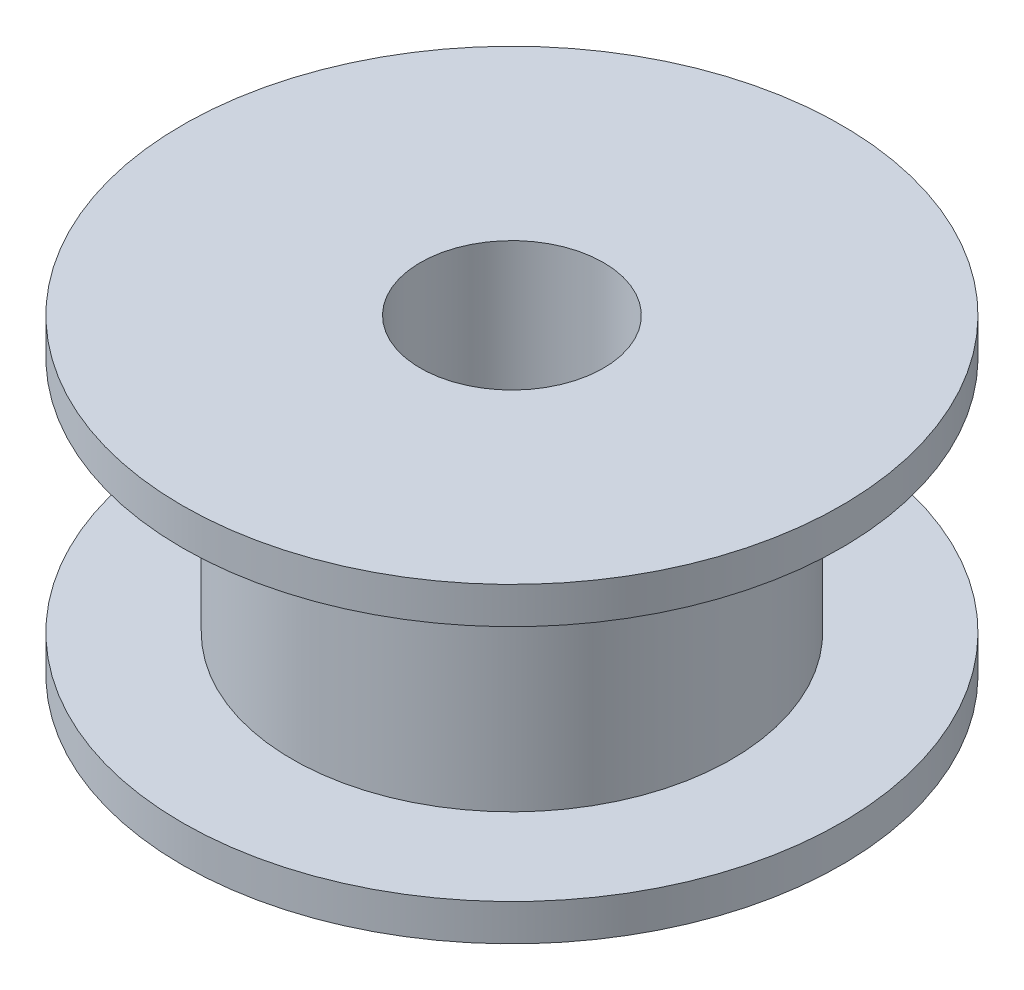
ISO-10303-21;
HEADER;
FILE_DESCRIPTION(('STEP AP214'),'2;1');
FILE_NAME('part.step','',(''),(''),'','','');
FILE_SCHEMA(('AUTOMOTIVE_DESIGN { 1 0 10303 214 1 1 1 1 }'));
ENDSEC;
DATA;
#1=APPLICATION_CONTEXT('core data for automotive mechanical design processes');
#2=APPLICATION_PROTOCOL_DEFINITION('international standard','automotive_design',2000,#1);
#3=PRODUCT_CONTEXT('',#1,'mechanical');
#4=PRODUCT('Part','Part','',(#3));
#5=PRODUCT_RELATED_PRODUCT_CATEGORY('part','',(#4));
#6=PRODUCT_DEFINITION_FORMATION('','',#4);
#7=PRODUCT_DEFINITION_CONTEXT('part definition',#1,'design');
#8=PRODUCT_DEFINITION('design','',#6,#7);
#9=PRODUCT_DEFINITION_SHAPE('','',#8);
#10=(LENGTH_UNIT() NAMED_UNIT(*) SI_UNIT(.MILLI.,.METRE.));
#11=(NAMED_UNIT(*) PLANE_ANGLE_UNIT() SI_UNIT($,.RADIAN.));
#12=(NAMED_UNIT(*) SI_UNIT($,.STERADIAN.) SOLID_ANGLE_UNIT());
#13=UNCERTAINTY_MEASURE_WITH_UNIT(LENGTH_MEASURE(1.E-05),#10,'distance_accuracy_value','');
#14=(GEOMETRIC_REPRESENTATION_CONTEXT(3) GLOBAL_UNCERTAINTY_ASSIGNED_CONTEXT((#13)) GLOBAL_UNIT_ASSIGNED_CONTEXT((#10,
#11,#12)) REPRESENTATION_CONTEXT('',''));
#15=CARTESIAN_POINT('',(0.,0.,0.));
#16=DIRECTION('',(0.,0.,1.));
#17=DIRECTION('',(1.,0.,0.));
#18=AXIS2_PLACEMENT_3D('',#15,#16,#17);
#19=CARTESIAN_POINT('',(0.,1.,0.));
#20=DIRECTION('',(0.,-1.,0.));
#21=DIRECTION('',(0.,0.,-1.));
#22=AXIS2_PLACEMENT_3D('',#19,#20,#21);
#23=CYLINDRICAL_SURFACE('',#22,9.);
#24=CARTESIAN_POINT('',(0.,1.,0.));
#25=DIRECTION('',(0.,1.,0.));
#26=DIRECTION('',(0.,0.,1.));
#27=AXIS2_PLACEMENT_3D('',#24,#25,#26);
#28=CIRCLE('',#27,9.);
#29=CARTESIAN_POINT('',(0.,1.,9.));
#30=VERTEX_POINT('',#29);
#31=EDGE_CURVE('E40',#30,#30,#28,.T.);
#32=ORIENTED_EDGE('',*,*,#31,.F.);
#33=EDGE_LOOP('',(#32));
#34=FACE_BOUND('',#33,.T.);
#35=CARTESIAN_POINT('',(0.,0.,0.));
#36=DIRECTION('',(0.,1.,0.));
#37=DIRECTION('',(0.,0.,1.));
#38=AXIS2_PLACEMENT_3D('',#35,#36,#37);
#39=CIRCLE('',#38,9.);
#40=CARTESIAN_POINT('',(0.,0.,9.));
#41=VERTEX_POINT('',#40);
#42=EDGE_CURVE('E36',#41,#41,#39,.T.);
#43=ORIENTED_EDGE('',*,*,#42,.T.);
#44=EDGE_LOOP('',(#43));
#45=FACE_BOUND('',#44,.T.);
#46=ADVANCED_FACE('F33',(#34,#45),#23,.T.);
#47=CARTESIAN_POINT('',(0.,1.,0.));
#48=DIRECTION('',(0.,1.,0.));
#49=DIRECTION('',(0.,0.,1.));
#50=AXIS2_PLACEMENT_3D('',#47,#48,#49);
#51=PLANE('',#50);
#52=CARTESIAN_POINT('',(0.,1.,0.));
#53=DIRECTION('',(0.,1.,0.));
#54=DIRECTION('',(0.,0.,1.));
#55=AXIS2_PLACEMENT_3D('',#52,#53,#54);
#56=CIRCLE('',#55,6.);
#57=CARTESIAN_POINT('',(0.,1.,-6.));
#58=VERTEX_POINT('',#57);
#59=EDGE_CURVE('E10',#58,#58,#56,.T.);
#60=ORIENTED_EDGE('',*,*,#59,.F.);
#61=EDGE_LOOP('',(#60));
#62=FACE_BOUND('',#61,.T.);
#63=ORIENTED_EDGE('',*,*,#31,.T.);
#64=EDGE_LOOP('',(#63));
#65=FACE_BOUND('',#64,.T.);
#66=ADVANCED_FACE('F76',(#62,#65),#51,.T.);
#67=CARTESIAN_POINT('',(0.,0.,0.));
#68=DIRECTION('',(0.,1.,0.));
#69=DIRECTION('',(0.,0.,1.));
#70=AXIS2_PLACEMENT_3D('',#67,#68,#69);
#71=PLANE('',#70);
#72=CARTESIAN_POINT('',(0.,0.,0.));
#73=DIRECTION('',(0.,-1.,0.));
#74=DIRECTION('',(0.,0.,-1.));
#75=AXIS2_PLACEMENT_3D('',#72,#73,#74);
#76=CIRCLE('',#75,2.5);
#77=CARTESIAN_POINT('',(0.,0.,-2.5));
#78=VERTEX_POINT('',#77);
#79=EDGE_CURVE('E56',#78,#78,#76,.T.);
#80=ORIENTED_EDGE('',*,*,#79,.F.);
#81=EDGE_LOOP('',(#80));
#82=FACE_BOUND('',#81,.T.);
#83=ORIENTED_EDGE('',*,*,#42,.F.);
#84=EDGE_LOOP('',(#83));
#85=FACE_BOUND('',#84,.T.);
#86=ADVANCED_FACE('F72',(#82,#85),#71,.F.);
#87=CARTESIAN_POINT('',(0.,7.5,0.));
#88=DIRECTION('',(0.,-1.,0.));
#89=DIRECTION('',(0.,0.,-1.));
#90=AXIS2_PLACEMENT_3D('',#87,#88,#89);
#91=CYLINDRICAL_SURFACE('',#90,6.);
#92=CARTESIAN_POINT('',(0.,7.5,0.));
#93=DIRECTION('',(0.,1.,0.));
#94=DIRECTION('',(0.,0.,1.));
#95=AXIS2_PLACEMENT_3D('',#92,#93,#94);
#96=CIRCLE('',#95,6.);
#97=CARTESIAN_POINT('',(0.,7.5,-6.));
#98=VERTEX_POINT('',#97);
#99=EDGE_CURVE('E46',#98,#98,#96,.T.);
#100=CARTESIAN_POINT('',(0.,7.5,-6.));
#101=CARTESIAN_POINT('',(0.,7.43229166666667,-6.));
#102=CARTESIAN_POINT('',(0.,7.36458333333333,-6.));
#103=CARTESIAN_POINT('',(0.,7.22916666666667,-6.));
#104=CARTESIAN_POINT('',(0.,7.16145833333333,-6.));
#105=CARTESIAN_POINT('',(0.,7.02604166666667,-6.));
#106=CARTESIAN_POINT('',(0.,6.95833333333333,-6.));
#107=CARTESIAN_POINT('',(0.,6.82291666666667,-6.));
#108=CARTESIAN_POINT('',(0.,6.75520833333333,-6.));
#109=CARTESIAN_POINT('',(0.,6.61979166666667,-6.));
#110=CARTESIAN_POINT('',(0.,6.55208333333333,-6.));
#111=CARTESIAN_POINT('',(0.,6.41666666666667,-6.));
#112=CARTESIAN_POINT('',(0.,6.34895833333333,-6.));
#113=CARTESIAN_POINT('',(0.,6.21354166666667,-6.));
#114=CARTESIAN_POINT('',(0.,6.14583333333333,-6.));
#115=CARTESIAN_POINT('',(0.,6.01041666666667,-6.));
#116=CARTESIAN_POINT('',(0.,5.94270833333333,-6.));
#117=CARTESIAN_POINT('',(0.,5.80729166666667,-6.));
#118=CARTESIAN_POINT('',(0.,5.73958333333333,-6.));
#119=CARTESIAN_POINT('',(0.,5.60416666666667,-6.));
#120=CARTESIAN_POINT('',(0.,5.53645833333333,-6.));
#121=CARTESIAN_POINT('',(0.,5.40104166666667,-6.));
#122=CARTESIAN_POINT('',(0.,5.33333333333333,-6.));
#123=CARTESIAN_POINT('',(0.,5.19791666666667,-6.));
#124=CARTESIAN_POINT('',(0.,5.13020833333333,-6.));
#125=CARTESIAN_POINT('',(0.,4.99479166666667,-6.));
#126=CARTESIAN_POINT('',(0.,4.92708333333333,-6.));
#127=CARTESIAN_POINT('',(0.,4.79166666666667,-6.));
#128=CARTESIAN_POINT('',(0.,4.72395833333333,-6.));
#129=CARTESIAN_POINT('',(0.,4.58854166666667,-6.));
#130=CARTESIAN_POINT('',(0.,4.52083333333333,-6.));
#131=CARTESIAN_POINT('',(0.,4.38541666666667,-6.));
#132=CARTESIAN_POINT('',(0.,4.31770833333333,-6.));
#133=CARTESIAN_POINT('',(0.,4.18229166666667,-6.));
#134=CARTESIAN_POINT('',(0.,4.11458333333333,-6.));
#135=CARTESIAN_POINT('',(0.,3.97916666666667,-6.));
#136=CARTESIAN_POINT('',(0.,3.91145833333333,-6.));
#137=CARTESIAN_POINT('',(0.,3.77604166666667,-6.));
#138=CARTESIAN_POINT('',(0.,3.70833333333333,-6.));
#139=CARTESIAN_POINT('',(0.,3.57291666666667,-6.));
#140=CARTESIAN_POINT('',(0.,3.50520833333333,-6.));
#141=CARTESIAN_POINT('',(0.,3.36979166666667,-6.));
#142=CARTESIAN_POINT('',(0.,3.30208333333333,-6.));
#143=CARTESIAN_POINT('',(0.,3.16666666666667,-6.));
#144=CARTESIAN_POINT('',(0.,3.09895833333333,-6.));
#145=CARTESIAN_POINT('',(0.,2.96354166666667,-6.));
#146=CARTESIAN_POINT('',(0.,2.89583333333333,-6.));
#147=CARTESIAN_POINT('',(0.,2.76041666666667,-6.));
#148=CARTESIAN_POINT('',(0.,2.69270833333333,-6.));
#149=CARTESIAN_POINT('',(0.,2.55729166666667,-6.));
#150=CARTESIAN_POINT('',(0.,2.48958333333333,-6.));
#151=CARTESIAN_POINT('',(0.,2.35416666666667,-6.));
#152=CARTESIAN_POINT('',(0.,2.28645833333333,-6.));
#153=CARTESIAN_POINT('',(0.,2.15104166666667,-6.));
#154=CARTESIAN_POINT('',(0.,2.08333333333333,-6.));
#155=CARTESIAN_POINT('',(0.,1.94791666666667,-6.));
#156=CARTESIAN_POINT('',(0.,1.88020833333333,-6.));
#157=CARTESIAN_POINT('',(0.,1.74479166666667,-6.));
#158=CARTESIAN_POINT('',(0.,1.67708333333333,-6.));
#159=CARTESIAN_POINT('',(0.,1.54166666666667,-6.));
#160=CARTESIAN_POINT('',(0.,1.47395833333333,-6.));
#161=CARTESIAN_POINT('',(0.,1.33854166666667,-6.));
#162=CARTESIAN_POINT('',(0.,1.27083333333333,-6.));
#163=CARTESIAN_POINT('',(0.,1.13541666666667,-6.));
#164=CARTESIAN_POINT('',(0.,1.06770833333333,-6.));
#165=CARTESIAN_POINT('',(0.,1.,-6.));
#166=B_SPLINE_CURVE_WITH_KNOTS('',3,(#100,#101,#102,#103,#104,#105,#106,#107,#108,#109,#110,
#111,#112,#113,#114,#115,#116,#117,#118,#119,#120,#121,#122,#123,#124,#125,#126,#127,#128,#129,
#130,#131,#132,#133,#134,#135,#136,#137,#138,#139,#140,#141,#142,#143,#144,#145,#146,#147,#148,
#149,#150,#151,#152,#153,#154,#155,#156,#157,#158,#159,#160,#161,#162,#163,#164,#165),
.UNSPECIFIED.,.F.,.F.,(4,2,2,2,2,2,2,2,2,2,2,2,2,2,2,2,2,2,2,2,2,2,2,2,2,2,2,2,2,2,2,2,4),(0.,
0.203125,0.40625,0.609375000000001,0.812500000000001,1.015625,1.21875,1.421875,1.625,1.828125,
2.03125,2.234375,2.4375,2.640625,2.84375,3.046875,3.25,3.453125,3.65625,3.859375,4.0625,
4.265625,4.46875,4.671875,4.875,5.078125,5.28125,5.484375,5.6875,5.890625,6.09375,6.296875,6.5),.UNSPECIFIED.);
#167=EDGE_CURVE('BSEAM75',#98,#58,#166,.T.);
#168=ORIENTED_EDGE('',*,*,#99,.F.);
#169=ORIENTED_EDGE('',*,*,#59,.T.);
#170=ORIENTED_EDGE('',*,*,#167,.T.);
#171=ORIENTED_EDGE('',*,*,#167,.F.);
#172=EDGE_LOOP('',(#168,#170,#169,#171));
#173=FACE_BOUND('',#172,.T.);
#174=ADVANCED_FACE('F75',(#173),#91,.T.);
#175=CARTESIAN_POINT('',(0.,8.5,0.));
#176=DIRECTION('',(0.,-1.,0.));
#177=DIRECTION('',(0.,0.,-1.));
#178=AXIS2_PLACEMENT_3D('',#175,#176,#177);
#179=CYLINDRICAL_SURFACE('',#178,9.);
#180=CARTESIAN_POINT('',(0.,8.5,0.));
#181=DIRECTION('',(0.,1.,0.));
#182=DIRECTION('',(0.,0.,1.));
#183=AXIS2_PLACEMENT_3D('',#180,#181,#182);
#184=CIRCLE('',#183,9.);
#185=CARTESIAN_POINT('',(0.,8.5,9.));
#186=VERTEX_POINT('',#185);
#187=EDGE_CURVE('E49',#186,#186,#184,.T.);
#188=ORIENTED_EDGE('',*,*,#187,.F.);
#189=EDGE_LOOP('',(#188));
#190=FACE_BOUND('',#189,.T.);
#191=CARTESIAN_POINT('',(0.,7.5,0.));
#192=DIRECTION('',(0.,1.,0.));
#193=DIRECTION('',(0.,0.,1.));
#194=AXIS2_PLACEMENT_3D('',#191,#192,#193);
#195=CIRCLE('',#194,9.);
#196=CARTESIAN_POINT('',(0.,7.5,9.));
#197=VERTEX_POINT('',#196);
#198=EDGE_CURVE('E50',#197,#197,#195,.T.);
#199=ORIENTED_EDGE('',*,*,#198,.T.);
#200=EDGE_LOOP('',(#199));
#201=FACE_BOUND('',#200,.T.);
#202=ADVANCED_FACE('F94',(#190,#201),#179,.T.);
#203=CARTESIAN_POINT('',(0.,8.5,0.));
#204=DIRECTION('',(0.,1.,0.));
#205=DIRECTION('',(0.,0.,1.));
#206=AXIS2_PLACEMENT_3D('',#203,#204,#205);
#207=PLANE('',#206);
#208=CARTESIAN_POINT('',(0.,8.5,0.));
#209=DIRECTION('',(0.,-1.,0.));
#210=DIRECTION('',(0.,0.,-1.));
#211=AXIS2_PLACEMENT_3D('',#208,#209,#210);
#212=CIRCLE('',#211,2.5);
#213=CARTESIAN_POINT('',(0.,8.5,-2.5));
#214=VERTEX_POINT('',#213);
#215=EDGE_CURVE('E53',#214,#214,#212,.T.);
#216=ORIENTED_EDGE('',*,*,#215,.T.);
#217=EDGE_LOOP('',(#216));
#218=FACE_BOUND('',#217,.T.);
#219=ORIENTED_EDGE('',*,*,#187,.T.);
#220=EDGE_LOOP('',(#219));
#221=FACE_BOUND('',#220,.T.);
#222=ADVANCED_FACE('F62',(#218,#221),#207,.T.);
#223=CARTESIAN_POINT('',(0.,7.5,0.));
#224=DIRECTION('',(0.,1.,0.));
#225=DIRECTION('',(0.,0.,1.));
#226=AXIS2_PLACEMENT_3D('',#223,#224,#225);
#227=PLANE('',#226);
#228=ORIENTED_EDGE('',*,*,#99,.T.);
#229=EDGE_LOOP('',(#228));
#230=FACE_BOUND('',#229,.T.);
#231=ORIENTED_EDGE('',*,*,#198,.F.);
#232=EDGE_LOOP('',(#231));
#233=FACE_BOUND('',#232,.T.);
#234=ADVANCED_FACE('F68',(#230,#233),#227,.F.);
#235=CARTESIAN_POINT('',(0.,8.5,0.));
#236=DIRECTION('',(0.,-1.,0.));
#237=DIRECTION('',(0.,0.,-1.));
#238=AXIS2_PLACEMENT_3D('',#235,#236,#237);
#239=CYLINDRICAL_SURFACE('',#238,2.5);
#240=ORIENTED_EDGE('',*,*,#215,.F.);
#241=EDGE_LOOP('',(#240));
#242=FACE_BOUND('',#241,.T.);
#243=ORIENTED_EDGE('',*,*,#79,.T.);
#244=EDGE_LOOP('',(#243));
#245=FACE_BOUND('',#244,.T.);
#246=ADVANCED_FACE('F65',(#242,#245),#239,.F.);
#247=CLOSED_SHELL('',(#46,#66,#86,#174,#202,#222,#234,#246));
#248=MANIFOLD_SOLID_BREP('B2',#247);
#249=ADVANCED_BREP_SHAPE_REPRESENTATION('',(#18,#248),#14);
#250=SHAPE_DEFINITION_REPRESENTATION(#9,#249);
ENDSEC;
END-ISO-10303-21;
